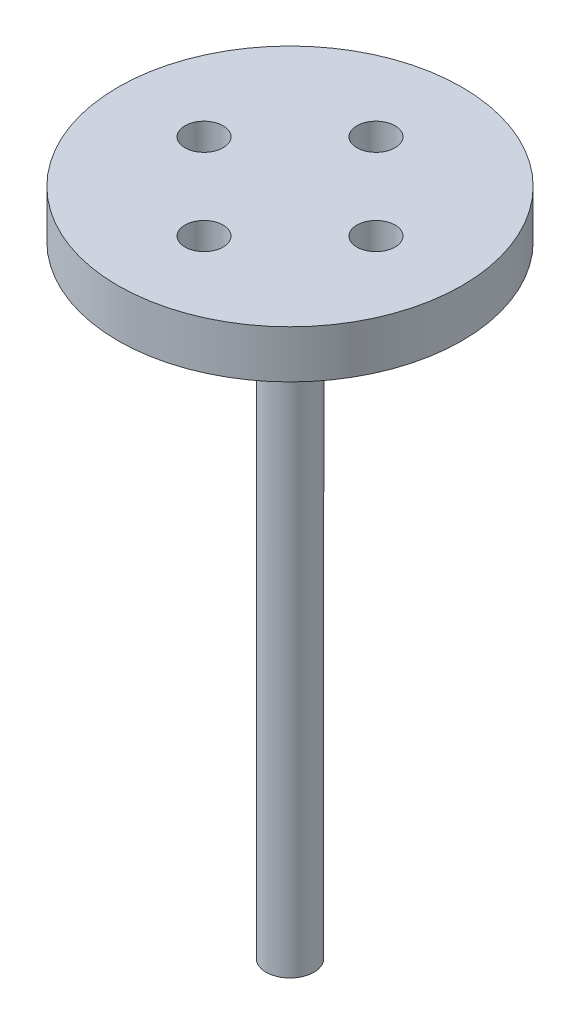
ISO-10303-21;
HEADER;
FILE_DESCRIPTION(('STEP AP214'),'2;1');
FILE_NAME('part.step','',(''),(''),'','','');
FILE_SCHEMA(('AUTOMOTIVE_DESIGN { 1 0 10303 214 1 1 1 1 }'));
ENDSEC;
DATA;
#1=APPLICATION_CONTEXT('core data for automotive mechanical design processes');
#2=APPLICATION_PROTOCOL_DEFINITION('international standard','automotive_design',2000,#1);
#3=PRODUCT_CONTEXT('',#1,'mechanical');
#4=PRODUCT('Part','Part','',(#3));
#5=PRODUCT_RELATED_PRODUCT_CATEGORY('part','',(#4));
#6=PRODUCT_DEFINITION_FORMATION('','',#4);
#7=PRODUCT_DEFINITION_CONTEXT('part definition',#1,'design');
#8=PRODUCT_DEFINITION('design','',#6,#7);
#9=PRODUCT_DEFINITION_SHAPE('','',#8);
#10=(LENGTH_UNIT() NAMED_UNIT(*) SI_UNIT(.MILLI.,.METRE.));
#11=(NAMED_UNIT(*) PLANE_ANGLE_UNIT() SI_UNIT($,.RADIAN.));
#12=(NAMED_UNIT(*) SI_UNIT($,.STERADIAN.) SOLID_ANGLE_UNIT());
#13=UNCERTAINTY_MEASURE_WITH_UNIT(LENGTH_MEASURE(1.E-05),#10,'distance_accuracy_value','');
#14=(GEOMETRIC_REPRESENTATION_CONTEXT(3) GLOBAL_UNCERTAINTY_ASSIGNED_CONTEXT((#13)) GLOBAL_UNIT_ASSIGNED_CONTEXT((#10,
#11,#12)) REPRESENTATION_CONTEXT('',''));
#15=CARTESIAN_POINT('',(0.,0.,0.));
#16=DIRECTION('',(0.,0.,1.));
#17=DIRECTION('',(1.,0.,0.));
#18=AXIS2_PLACEMENT_3D('',#15,#16,#17);
#19=CARTESIAN_POINT('',(0.,5.,0.));
#20=DIRECTION('',(0.,1.,0.));
#21=DIRECTION('',(0.,0.,1.));
#22=AXIS2_PLACEMENT_3D('',#19,#20,#21);
#23=PLANE('',#22);
#24=CARTESIAN_POINT('',(-9.,5.,0.));
#25=DIRECTION('',(0.,1.,0.));
#26=DIRECTION('',(0.,0.,1.));
#27=AXIS2_PLACEMENT_3D('',#24,#25,#26);
#28=CIRCLE('',#27,2.);
#29=CARTESIAN_POINT('',(-9.,5.,2.));
#30=VERTEX_POINT('',#29);
#31=EDGE_CURVE('E70',#30,#30,#28,.T.);
#32=ORIENTED_EDGE('',*,*,#31,.F.);
#33=EDGE_LOOP('',(#32));
#34=FACE_BOUND('',#33,.T.);
#35=CARTESIAN_POINT('',(0.,5.,-9.));
#36=DIRECTION('',(0.,1.,0.));
#37=DIRECTION('',(0.,0.,1.));
#38=AXIS2_PLACEMENT_3D('',#35,#36,#37);
#39=CIRCLE('',#38,2.);
#40=CARTESIAN_POINT('',(0.,5.,-7.));
#41=VERTEX_POINT('',#40);
#42=EDGE_CURVE('E56',#41,#41,#39,.T.);
#43=ORIENTED_EDGE('',*,*,#42,.F.);
#44=EDGE_LOOP('',(#43));
#45=FACE_BOUND('',#44,.T.);
#46=CARTESIAN_POINT('',(0.,5.,0.));
#47=DIRECTION('',(0.,1.,0.));
#48=DIRECTION('',(0.,0.,1.));
#49=AXIS2_PLACEMENT_3D('',#46,#47,#48);
#50=CIRCLE('',#49,18.);
#51=CARTESIAN_POINT('',(0.,5.,18.));
#52=VERTEX_POINT('',#51);
#53=EDGE_CURVE('E45',#52,#52,#50,.T.);
#54=ORIENTED_EDGE('',*,*,#53,.T.);
#55=EDGE_LOOP('',(#54));
#56=FACE_BOUND('',#55,.T.);
#57=CARTESIAN_POINT('',(9.,5.,0.));
#58=DIRECTION('',(0.,1.,0.));
#59=DIRECTION('',(0.,0.,1.));
#60=AXIS2_PLACEMENT_3D('',#57,#58,#59);
#61=CIRCLE('',#60,2.);
#62=CARTESIAN_POINT('',(9.,5.,2.));
#63=VERTEX_POINT('',#62);
#64=EDGE_CURVE('E62',#63,#63,#61,.T.);
#65=ORIENTED_EDGE('',*,*,#64,.F.);
#66=EDGE_LOOP('',(#65));
#67=FACE_BOUND('',#66,.T.);
#68=CARTESIAN_POINT('',(0.,5.,9.));
#69=DIRECTION('',(0.,1.,0.));
#70=DIRECTION('',(0.,0.,1.));
#71=AXIS2_PLACEMENT_3D('',#68,#69,#70);
#72=CIRCLE('',#71,2.);
#73=CARTESIAN_POINT('',(0.,5.,11.));
#74=VERTEX_POINT('',#73);
#75=EDGE_CURVE('E78',#74,#74,#72,.T.);
#76=ORIENTED_EDGE('',*,*,#75,.F.);
#77=EDGE_LOOP('',(#76));
#78=FACE_BOUND('',#77,.T.);
#79=ADVANCED_FACE('F37',(#34,#45,#56,#67,#78),#23,.T.);
#80=CARTESIAN_POINT('',(0.,0.,0.));
#81=DIRECTION('',(0.,1.,0.));
#82=DIRECTION('',(0.,0.,1.));
#83=AXIS2_PLACEMENT_3D('',#80,#81,#82);
#84=PLANE('',#83);
#85=CARTESIAN_POINT('',(0.,0.,0.));
#86=DIRECTION('',(0.,1.,0.));
#87=DIRECTION('',(0.,0.,1.));
#88=AXIS2_PLACEMENT_3D('',#85,#86,#87);
#89=CIRCLE('',#88,2.5);
#90=CARTESIAN_POINT('',(0.,0.,2.5));
#91=VERTEX_POINT('',#90);
#92=EDGE_CURVE('E10',#91,#91,#89,.F.);
#93=ORIENTED_EDGE('',*,*,#92,.F.);
#94=EDGE_LOOP('',(#93));
#95=FACE_BOUND('',#94,.T.);
#96=CARTESIAN_POINT('',(0.,0.,0.));
#97=DIRECTION('',(0.,1.,0.));
#98=DIRECTION('',(0.,0.,1.));
#99=AXIS2_PLACEMENT_3D('',#96,#97,#98);
#100=CIRCLE('',#99,18.);
#101=CARTESIAN_POINT('',(0.,0.,18.));
#102=VERTEX_POINT('',#101);
#103=EDGE_CURVE('E50',#102,#102,#100,.T.);
#104=ORIENTED_EDGE('',*,*,#103,.F.);
#105=EDGE_LOOP('',(#104));
#106=FACE_BOUND('',#105,.T.);
#107=CARTESIAN_POINT('',(0.,0.,-9.));
#108=DIRECTION('',(0.,1.,0.));
#109=DIRECTION('',(0.,0.,1.));
#110=AXIS2_PLACEMENT_3D('',#107,#108,#109);
#111=CIRCLE('',#110,2.);
#112=CARTESIAN_POINT('',(0.,0.,-7.));
#113=VERTEX_POINT('',#112);
#114=EDGE_CURVE('E58',#113,#113,#111,.T.);
#115=ORIENTED_EDGE('',*,*,#114,.T.);
#116=EDGE_LOOP('',(#115));
#117=FACE_BOUND('',#116,.T.);
#118=CARTESIAN_POINT('',(9.,0.,0.));
#119=DIRECTION('',(0.,1.,0.));
#120=DIRECTION('',(0.,0.,1.));
#121=AXIS2_PLACEMENT_3D('',#118,#119,#120);
#122=CIRCLE('',#121,2.);
#123=CARTESIAN_POINT('',(9.,0.,2.));
#124=VERTEX_POINT('',#123);
#125=EDGE_CURVE('E66',#124,#124,#122,.T.);
#126=ORIENTED_EDGE('',*,*,#125,.T.);
#127=EDGE_LOOP('',(#126));
#128=FACE_BOUND('',#127,.T.);
#129=CARTESIAN_POINT('',(-9.,0.,0.));
#130=DIRECTION('',(0.,1.,0.));
#131=DIRECTION('',(0.,0.,1.));
#132=AXIS2_PLACEMENT_3D('',#129,#130,#131);
#133=CIRCLE('',#132,2.);
#134=CARTESIAN_POINT('',(-9.,0.,2.));
#135=VERTEX_POINT('',#134);
#136=EDGE_CURVE('E74',#135,#135,#133,.T.);
#137=ORIENTED_EDGE('',*,*,#136,.T.);
#138=EDGE_LOOP('',(#137));
#139=FACE_BOUND('',#138,.T.);
#140=CARTESIAN_POINT('',(0.,0.,9.));
#141=DIRECTION('',(0.,1.,0.));
#142=DIRECTION('',(0.,0.,1.));
#143=AXIS2_PLACEMENT_3D('',#140,#141,#142);
#144=CIRCLE('',#143,2.);
#145=CARTESIAN_POINT('',(0.,0.,11.));
#146=VERTEX_POINT('',#145);
#147=EDGE_CURVE('E82',#146,#146,#144,.T.);
#148=ORIENTED_EDGE('',*,*,#147,.T.);
#149=EDGE_LOOP('',(#148));
#150=FACE_BOUND('',#149,.T.);
#151=ADVANCED_FACE('F109',(#95,#106,#117,#128,#139,#150),#84,.F.);
#152=CARTESIAN_POINT('',(0.,5.,0.));
#153=DIRECTION('',(0.,-1.,0.));
#154=DIRECTION('',(0.,0.,-1.));
#155=AXIS2_PLACEMENT_3D('',#152,#153,#154);
#156=CYLINDRICAL_SURFACE('',#155,18.);
#157=ORIENTED_EDGE('',*,*,#53,.F.);
#158=EDGE_LOOP('',(#157));
#159=FACE_BOUND('',#158,.T.);
#160=ORIENTED_EDGE('',*,*,#103,.T.);
#161=EDGE_LOOP('',(#160));
#162=FACE_BOUND('',#161,.T.);
#163=ADVANCED_FACE('F39',(#159,#162),#156,.T.);
#164=CARTESIAN_POINT('',(0.,5.,-9.));
#165=DIRECTION('',(0.,-1.,0.));
#166=DIRECTION('',(0.,0.,-1.));
#167=AXIS2_PLACEMENT_3D('',#164,#165,#166);
#168=CYLINDRICAL_SURFACE('',#167,2.);
#169=ORIENTED_EDGE('',*,*,#42,.T.);
#170=EDGE_LOOP('',(#169));
#171=FACE_BOUND('',#170,.T.);
#172=ORIENTED_EDGE('',*,*,#114,.F.);
#173=EDGE_LOOP('',(#172));
#174=FACE_BOUND('',#173,.T.);
#175=ADVANCED_FACE('F119',(#171,#174),#168,.F.);
#176=CARTESIAN_POINT('',(9.,5.,0.));
#177=DIRECTION('',(0.,-1.,0.));
#178=DIRECTION('',(0.,0.,-1.));
#179=AXIS2_PLACEMENT_3D('',#176,#177,#178);
#180=CYLINDRICAL_SURFACE('',#179,2.);
#181=ORIENTED_EDGE('',*,*,#64,.T.);
#182=EDGE_LOOP('',(#181));
#183=FACE_BOUND('',#182,.T.);
#184=ORIENTED_EDGE('',*,*,#125,.F.);
#185=EDGE_LOOP('',(#184));
#186=FACE_BOUND('',#185,.T.);
#187=ADVANCED_FACE('F122',(#183,#186),#180,.F.);
#188=CARTESIAN_POINT('',(-9.,5.,0.));
#189=DIRECTION('',(0.,-1.,0.));
#190=DIRECTION('',(0.,0.,-1.));
#191=AXIS2_PLACEMENT_3D('',#188,#189,#190);
#192=CYLINDRICAL_SURFACE('',#191,2.);
#193=ORIENTED_EDGE('',*,*,#31,.T.);
#194=EDGE_LOOP('',(#193));
#195=FACE_BOUND('',#194,.T.);
#196=ORIENTED_EDGE('',*,*,#136,.F.);
#197=EDGE_LOOP('',(#196));
#198=FACE_BOUND('',#197,.T.);
#199=ADVANCED_FACE('F105',(#195,#198),#192,.F.);
#200=CARTESIAN_POINT('',(0.,5.,9.));
#201=DIRECTION('',(0.,-1.,0.));
#202=DIRECTION('',(0.,0.,-1.));
#203=AXIS2_PLACEMENT_3D('',#200,#201,#202);
#204=CYLINDRICAL_SURFACE('',#203,2.);
#205=ORIENTED_EDGE('',*,*,#75,.T.);
#206=EDGE_LOOP('',(#205));
#207=FACE_BOUND('',#206,.T.);
#208=ORIENTED_EDGE('',*,*,#147,.F.);
#209=EDGE_LOOP('',(#208));
#210=FACE_BOUND('',#209,.T.);
#211=ADVANCED_FACE('F98',(#207,#210),#204,.F.);
#212=CARTESIAN_POINT('',(0.,-65.,0.));
#213=DIRECTION('',(0.,1.,0.));
#214=DIRECTION('',(0.,0.,1.));
#215=AXIS2_PLACEMENT_3D('',#212,#213,#214);
#216=CYLINDRICAL_SURFACE('',#215,2.5);
#217=CARTESIAN_POINT('',(0.,-65.,0.));
#218=DIRECTION('',(0.,-1.,0.));
#219=DIRECTION('',(0.,0.,-1.));
#220=AXIS2_PLACEMENT_3D('',#217,#218,#219);
#221=CIRCLE('',#220,2.5);
#222=CARTESIAN_POINT('',(0.,-65.,-2.5));
#223=VERTEX_POINT('',#222);
#224=EDGE_CURVE('E86',#223,#223,#221,.T.);
#225=ORIENTED_EDGE('',*,*,#224,.F.);
#226=EDGE_LOOP('',(#225));
#227=FACE_BOUND('',#226,.T.);
#228=ORIENTED_EDGE('',*,*,#92,.T.);
#229=EDGE_LOOP('',(#228));
#230=FACE_BOUND('',#229,.T.);
#231=ADVANCED_FACE('F96',(#227,#230),#216,.T.);
#232=CARTESIAN_POINT('',(0.,-65.,0.));
#233=DIRECTION('',(0.,-1.,0.));
#234=DIRECTION('',(0.,0.,-1.));
#235=AXIS2_PLACEMENT_3D('',#232,#233,#234);
#236=PLANE('',#235);
#237=ORIENTED_EDGE('',*,*,#224,.T.);
#238=EDGE_LOOP('',(#237));
#239=FACE_BOUND('',#238,.T.);
#240=ADVANCED_FACE('F94',(#239),#236,.T.);
#241=CLOSED_SHELL('',(#79,#151,#163,#175,#187,#199,#211,#231,#240));
#242=MANIFOLD_SOLID_BREP('B2',#241);
#243=ADVANCED_BREP_SHAPE_REPRESENTATION('',(#18,#242),#14);
#244=SHAPE_DEFINITION_REPRESENTATION(#9,#243);
ENDSEC;
END-ISO-10303-21;
